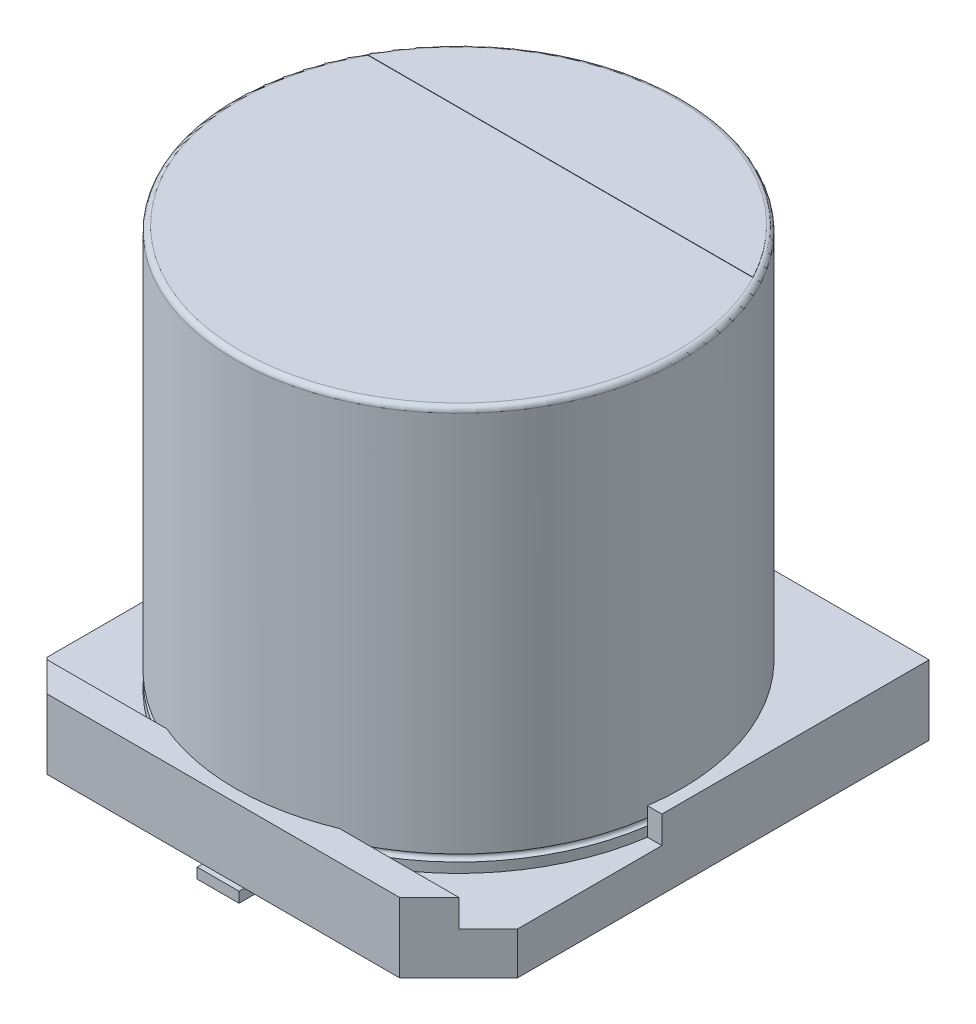
ISO-10303-21;
HEADER;
FILE_DESCRIPTION(('STEP AP214'),'2;1');
FILE_NAME('part.step','',(''),(''),'','','');
FILE_SCHEMA(('AUTOMOTIVE_DESIGN { 1 0 10303 214 1 1 1 1 }'));
ENDSEC;
DATA;
#1=APPLICATION_CONTEXT('core data for automotive mechanical design processes');
#2=APPLICATION_PROTOCOL_DEFINITION('international standard','automotive_design',2000,#1);
#3=PRODUCT_CONTEXT('',#1,'mechanical');
#4=PRODUCT('Part','Part','',(#3));
#5=PRODUCT_RELATED_PRODUCT_CATEGORY('part','',(#4));
#6=PRODUCT_DEFINITION_FORMATION('','',#4);
#7=PRODUCT_DEFINITION_CONTEXT('part definition',#1,'design');
#8=PRODUCT_DEFINITION('design','',#6,#7);
#9=PRODUCT_DEFINITION_SHAPE('','',#8);
#10=(LENGTH_UNIT() NAMED_UNIT(*) SI_UNIT(.MILLI.,.METRE.));
#11=(NAMED_UNIT(*) PLANE_ANGLE_UNIT() SI_UNIT($,.RADIAN.));
#12=(NAMED_UNIT(*) SI_UNIT($,.STERADIAN.) SOLID_ANGLE_UNIT());
#13=UNCERTAINTY_MEASURE_WITH_UNIT(LENGTH_MEASURE(1.E-05),#10,'distance_accuracy_value','');
#14=(GEOMETRIC_REPRESENTATION_CONTEXT(3) GLOBAL_UNCERTAINTY_ASSIGNED_CONTEXT((#13)) GLOBAL_UNIT_ASSIGNED_CONTEXT((#10,
#11,#12)) REPRESENTATION_CONTEXT('',''));
#15=CARTESIAN_POINT('',(0.,0.,0.));
#16=DIRECTION('',(0.,0.,1.));
#17=DIRECTION('',(1.,0.,0.));
#18=AXIS2_PLACEMENT_3D('',#15,#16,#17);
#19=CARTESIAN_POINT('',(0.,0.,0.));
#20=DIRECTION('',(0.,-1.,0.));
#21=DIRECTION('',(0.,0.,-1.));
#22=AXIS2_PLACEMENT_3D('',#19,#20,#21);
#23=PLANE('',#22);
#24=DIRECTION('',(-1.,0.,0.));
#25=VECTOR('',#24,1.);
#26=CARTESIAN_POINT('',(0.6,0.,-2.2));
#27=LINE('',#26,#25);
#28=CARTESIAN_POINT('',(0.6,0.,-2.2));
#29=VERTEX_POINT('',#28);
#30=CARTESIAN_POINT('',(-0.6,0.,-2.2));
#31=VERTEX_POINT('',#30);
#32=EDGE_CURVE('E721',#29,#31,#27,.T.);
#33=ORIENTED_EDGE('',*,*,#32,.F.);
#34=DIRECTION('',(0.,0.,-1.));
#35=VECTOR('',#34,1.);
#36=CARTESIAN_POINT('',(0.599999999999999,0.,0.));
#37=LINE('',#36,#35);
#38=CARTESIAN_POINT('',(0.600000000000001,0.,-6.75));
#39=VERTEX_POINT('',#38);
#40=EDGE_CURVE('E11',#29,#39,#37,.T.);
#41=ORIENTED_EDGE('',*,*,#40,.T.);
#42=DIRECTION('',(-1.,0.,0.));
#43=VECTOR('',#42,1.);
#44=CARTESIAN_POINT('',(-6.75,0.,-6.75));
#45=LINE('',#44,#43);
#46=CARTESIAN_POINT('',(6.75,0.,-6.75));
#47=VERTEX_POINT('',#46);
#48=EDGE_CURVE('E419',#47,#39,#45,.T.);
#49=ORIENTED_EDGE('',*,*,#48,.F.);
#50=DIRECTION('',(0.,0.,-1.));
#51=VECTOR('',#50,1.);
#52=CARTESIAN_POINT('',(6.75,0.,-6.75));
#53=LINE('',#52,#51);
#54=CARTESIAN_POINT('',(6.75,0.,5.06177222539985));
#55=VERTEX_POINT('',#54);
#56=EDGE_CURVE('E453',#55,#47,#53,.T.);
#57=ORIENTED_EDGE('',*,*,#56,.F.);
#58=DIRECTION('',(0.707106781186547,0.,-0.707106781186548));
#59=VECTOR('',#58,1.);
#60=CARTESIAN_POINT('',(6.75,0.,5.06177222539985));
#61=LINE('',#60,#59);
#62=CARTESIAN_POINT('',(5.06177222539986,0.,6.75));
#63=VERTEX_POINT('',#62);
#64=EDGE_CURVE('E448',#63,#55,#61,.T.);
#65=ORIENTED_EDGE('',*,*,#64,.F.);
#66=DIRECTION('',(1.,0.,0.));
#67=VECTOR('',#66,1.);
#68=CARTESIAN_POINT('',(5.06177222539986,0.,6.75));
#69=LINE('',#68,#67);
#70=CARTESIAN_POINT('',(0.599999999999999,0.,6.75));
#71=VERTEX_POINT('',#70);
#72=EDGE_CURVE('E443',#71,#63,#69,.T.);
#73=ORIENTED_EDGE('',*,*,#72,.F.);
#74=DIRECTION('',(0.,0.,1.));
#75=VECTOR('',#74,1.);
#76=CARTESIAN_POINT('',(0.599999999999999,0.,2.2));
#77=LINE('',#76,#75);
#78=CARTESIAN_POINT('',(0.599999999999999,0.,2.2));
#79=VERTEX_POINT('',#78);
#80=EDGE_CURVE('E292',#79,#71,#77,.T.);
#81=ORIENTED_EDGE('',*,*,#80,.F.);
#82=DIRECTION('',(1.,0.,0.));
#83=VECTOR('',#82,1.);
#84=CARTESIAN_POINT('',(0.599999999999999,0.,2.2));
#85=LINE('',#84,#83);
#86=CARTESIAN_POINT('',(-0.600000000000001,0.,2.2));
#87=VERTEX_POINT('',#86);
#88=EDGE_CURVE('E65',#87,#79,#85,.T.);
#89=ORIENTED_EDGE('',*,*,#88,.F.);
#90=DIRECTION('',(0.,0.,-1.));
#91=VECTOR('',#90,1.);
#92=CARTESIAN_POINT('',(-0.600000000000001,0.,2.2));
#93=LINE('',#92,#91);
#94=CARTESIAN_POINT('',(-0.600000000000001,0.,6.75));
#95=VERTEX_POINT('',#94);
#96=EDGE_CURVE('E50',#95,#87,#93,.T.);
#97=ORIENTED_EDGE('',*,*,#96,.F.);
#98=CARTESIAN_POINT('',(-5.06177222539986,0.,6.75));
#99=VERTEX_POINT('',#98);
#100=EDGE_CURVE('E444',#99,#95,#69,.T.);
#101=ORIENTED_EDGE('',*,*,#100,.F.);
#102=DIRECTION('',(0.707106781186547,0.,0.707106781186548));
#103=VECTOR('',#102,1.);
#104=CARTESIAN_POINT('',(-5.06177222539986,0.,6.75));
#105=LINE('',#104,#103);
#106=CARTESIAN_POINT('',(-6.75,0.,5.06177222539985));
#107=VERTEX_POINT('',#106);
#108=EDGE_CURVE('E440',#107,#99,#105,.T.);
#109=ORIENTED_EDGE('',*,*,#108,.F.);
#110=DIRECTION('',(0.,0.,1.));
#111=VECTOR('',#110,1.);
#112=CARTESIAN_POINT('',(-6.75,0.,5.06177222539985));
#113=LINE('',#112,#111);
#114=CARTESIAN_POINT('',(-6.75,0.,-6.75));
#115=VERTEX_POINT('',#114);
#116=EDGE_CURVE('E436',#115,#107,#113,.T.);
#117=ORIENTED_EDGE('',*,*,#116,.F.);
#118=CARTESIAN_POINT('',(-0.599999999999999,0.,-6.75));
#119=VERTEX_POINT('',#118);
#120=EDGE_CURVE('E456',#119,#115,#45,.T.);
#121=ORIENTED_EDGE('',*,*,#120,.F.);
#122=DIRECTION('',(0.,0.,-1.));
#123=VECTOR('',#122,1.);
#124=CARTESIAN_POINT('',(-0.6,0.,-2.2));
#125=LINE('',#124,#123);
#126=EDGE_CURVE('E720',#31,#119,#125,.T.);
#127=ORIENTED_EDGE('',*,*,#126,.F.);
#128=EDGE_LOOP('',(#33,#41,#49,#57,#65,#73,#81,#89,#97,#101,#109,#117,#121,#127));
#129=FACE_BOUND('',#128,.T.);
#130=ADVANCED_FACE('F41',(#129),#23,.T.);
#131=CARTESIAN_POINT('',(-6.25,12.8,0.));
#132=DIRECTION('',(0.,1.,0.));
#133=DIRECTION('',(0.,0.,1.));
#134=AXIS2_PLACEMENT_3D('',#131,#132,#133);
#135=PLANE('',#134);
#136=CARTESIAN_POINT('',(0.,12.8,0.));
#137=DIRECTION('',(0.,1.,0.));
#138=DIRECTION('',(0.,0.,1.));
#139=AXIS2_PLACEMENT_3D('',#136,#137,#138);
#140=CIRCLE('',#139,6.25);
#141=CARTESIAN_POINT('',(-5.52535958859638,12.8,-2.92111304415047));
#142=VERTEX_POINT('',#141);
#143=CARTESIAN_POINT('',(5.52535958859638,12.8,-2.92111304415047));
#144=VERTEX_POINT('',#143);
#145=EDGE_CURVE('E348',#142,#144,#140,.T.);
#146=ORIENTED_EDGE('',*,*,#145,.T.);
#147=DIRECTION('',(1.,0.,0.));
#148=VECTOR('',#147,1.);
#149=CARTESIAN_POINT('',(-5.52535958859638,12.8,-2.92111304415047));
#150=LINE('',#149,#148);
#151=EDGE_CURVE('E313',#142,#144,#150,.T.);
#152=ORIENTED_EDGE('',*,*,#151,.F.);
#153=EDGE_LOOP('',(#146,#152));
#154=FACE_BOUND('',#153,.T.);
#155=ADVANCED_FACE('F572',(#154),#135,.T.);
#156=CARTESIAN_POINT('',(0.,1.,0.));
#157=DIRECTION('',(0.,1.,0.));
#158=DIRECTION('',(0.,0.,1.));
#159=AXIS2_PLACEMENT_3D('',#156,#157,#158);
#160=CYLINDRICAL_SURFACE('',#159,6.4);
#161=DIRECTION('',(0.,1.,0.));
#162=VECTOR('',#161,1.);
#163=CARTESIAN_POINT('',(6.33403504884525,1.,0.916515138991168));
#164=LINE('',#163,#162);
#165=CARTESIAN_POINT('',(6.33403504884525,1.5,0.916515138991168));
#166=VERTEX_POINT('',#165);
#167=CARTESIAN_POINT('',(6.33403504884525,1.7,0.916515138991168));
#168=VERTEX_POINT('',#167);
#169=EDGE_CURVE('E492',#166,#168,#164,.T.);
#170=ORIENTED_EDGE('',*,*,#169,.T.);
#171=CARTESIAN_POINT('',(0.,1.7,0.));
#172=DIRECTION('',(0.,1.,0.));
#173=DIRECTION('',(0.,0.,1.));
#174=AXIS2_PLACEMENT_3D('',#171,#172,#173);
#175=CIRCLE('',#174,6.4);
#176=CARTESIAN_POINT('',(-6.33403504884525,1.7,0.916515138991168));
#177=VERTEX_POINT('',#176);
#178=EDGE_CURVE('E344',#168,#177,#175,.T.);
#179=ORIENTED_EDGE('',*,*,#178,.T.);
#180=DIRECTION('',(0.,1.,0.));
#181=VECTOR('',#180,1.);
#182=CARTESIAN_POINT('',(-6.33403504884525,1.,0.916515138991168));
#183=LINE('',#182,#181);
#184=CARTESIAN_POINT('',(-6.33403504884525,1.5,0.916515138991168));
#185=VERTEX_POINT('',#184);
#186=EDGE_CURVE('E500',#177,#185,#183,.F.);
#187=ORIENTED_EDGE('',*,*,#186,.T.);
#188=CARTESIAN_POINT('',(0.,1.5,0.));
#189=DIRECTION('',(0.,1.,0.));
#190=DIRECTION('',(0.,0.,1.));
#191=AXIS2_PLACEMENT_3D('',#188,#189,#190);
#192=CIRCLE('',#191,6.4);
#193=EDGE_CURVE('E338',#166,#185,#192,.T.);
#194=ORIENTED_EDGE('',*,*,#193,.F.);
#195=EDGE_LOOP('',(#170,#179,#187,#194));
#196=FACE_BOUND('',#195,.T.);
#197=ADVANCED_FACE('F517',(#196),#160,.F.);
#198=CARTESIAN_POINT('',(0.,2.,0.));
#199=DIRECTION('',(0.,-1.,0.));
#200=DIRECTION('',(0.,0.,-1.));
#201=AXIS2_PLACEMENT_3D('',#198,#199,#200);
#202=PLANE('',#201);
#203=DIRECTION('',(0.,0.,1.));
#204=VECTOR('',#203,1.);
#205=CARTESIAN_POINT('',(-6.75,2.,5.06177222539985));
#206=LINE('',#205,#204);
#207=CARTESIAN_POINT('',(-6.75,2.,-6.75));
#208=VERTEX_POINT('',#207);
#209=CARTESIAN_POINT('',(-6.75,2.,0.916515138991168));
#210=VERTEX_POINT('',#209);
#211=EDGE_CURVE('E414',#208,#210,#206,.T.);
#212=ORIENTED_EDGE('',*,*,#211,.T.);
#213=DIRECTION('',(1.,0.,0.));
#214=VECTOR('',#213,1.);
#215=CARTESIAN_POINT('',(0.,2.,0.916515138991168));
#216=LINE('',#215,#214);
#217=CARTESIAN_POINT('',(-6.33403504884525,2.,0.916515138991168));
#218=VERTEX_POINT('',#217);
#219=EDGE_CURVE('E408',#210,#218,#216,.T.);
#220=ORIENTED_EDGE('',*,*,#219,.T.);
#221=CARTESIAN_POINT('',(0.,2.,0.));
#222=DIRECTION('',(0.,1.,0.));
#223=DIRECTION('',(0.,0.,1.));
#224=AXIS2_PLACEMENT_3D('',#221,#222,#223);
#225=CIRCLE('',#224,6.4);
#226=CARTESIAN_POINT('',(6.33403504884525,2.,0.916515138991168));
#227=VERTEX_POINT('',#226);
#228=EDGE_CURVE('E413',#227,#218,#225,.T.);
#229=ORIENTED_EDGE('',*,*,#228,.F.);
#230=CARTESIAN_POINT('',(6.75,2.,0.916515138991168));
#231=VERTEX_POINT('',#230);
#232=EDGE_CURVE('E404',#227,#231,#216,.T.);
#233=ORIENTED_EDGE('',*,*,#232,.T.);
#234=DIRECTION('',(0.,0.,-1.));
#235=VECTOR('',#234,1.);
#236=CARTESIAN_POINT('',(6.75,2.,-6.75));
#237=LINE('',#236,#235);
#238=CARTESIAN_POINT('',(6.75,2.,-6.75));
#239=VERTEX_POINT('',#238);
#240=EDGE_CURVE('E429',#231,#239,#237,.T.);
#241=ORIENTED_EDGE('',*,*,#240,.T.);
#242=DIRECTION('',(-1.,0.,0.));
#243=VECTOR('',#242,1.);
#244=CARTESIAN_POINT('',(-6.75,2.,-6.75));
#245=LINE('',#244,#243);
#246=EDGE_CURVE('E432',#239,#208,#245,.T.);
#247=ORIENTED_EDGE('',*,*,#246,.T.);
#248=EDGE_LOOP('',(#212,#220,#229,#233,#241,#247));
#249=FACE_BOUND('',#248,.T.);
#250=ADVANCED_FACE('F604',(#249),#202,.F.);
#251=CARTESIAN_POINT('',(-6.75,2.,5.06177222539985));
#252=DIRECTION('',(1.,0.,0.));
#253=DIRECTION('',(0.,0.,-1.));
#254=AXIS2_PLACEMENT_3D('',#251,#252,#253);
#255=PLANE('',#254);
#256=DIRECTION('',(0.,0.,1.));
#257=VECTOR('',#256,1.);
#258=CARTESIAN_POINT('',(-6.75,1.21736242578591,0.916515138991168));
#259=LINE('',#258,#257);
#260=CARTESIAN_POINT('',(-6.75,1.21736242578591,0.916515138991168));
#261=VERTEX_POINT('',#260);
#262=CARTESIAN_POINT('',(-6.75,1.21736242578591,5.06177222539985));
#263=VERTEX_POINT('',#262);
#264=EDGE_CURVE('E370',#261,#263,#259,.T.);
#265=ORIENTED_EDGE('',*,*,#264,.F.);
#266=DIRECTION('',(0.,-1.,0.));
#267=VECTOR('',#266,1.);
#268=CARTESIAN_POINT('',(-6.75,1.21736242578591,0.916515138991168));
#269=LINE('',#268,#267);
#270=EDGE_CURVE('E362',#210,#261,#269,.T.);
#271=ORIENTED_EDGE('',*,*,#270,.F.);
#272=ORIENTED_EDGE('',*,*,#211,.F.);
#273=DIRECTION('',(0.,-1.,0.));
#274=VECTOR('',#273,1.);
#275=CARTESIAN_POINT('',(-6.75,2.,-6.75));
#276=LINE('',#275,#274);
#277=EDGE_CURVE('E435',#208,#115,#276,.T.);
#278=ORIENTED_EDGE('',*,*,#277,.T.);
#279=ORIENTED_EDGE('',*,*,#116,.T.);
#280=DIRECTION('',(0.,-1.,0.));
#281=VECTOR('',#280,1.);
#282=CARTESIAN_POINT('',(-6.75,2.,5.06177222539985));
#283=LINE('',#282,#281);
#284=EDGE_CURVE('E479',#263,#107,#283,.T.);
#285=ORIENTED_EDGE('',*,*,#284,.F.);
#286=EDGE_LOOP('',(#265,#271,#272,#278,#279,#285));
#287=FACE_BOUND('',#286,.T.);
#288=ADVANCED_FACE('F43',(#287),#255,.F.);
#289=CARTESIAN_POINT('',(-5.06177222539986,2.,6.75));
#290=DIRECTION('',(0.707106781186548,0.,-0.707106781186547));
#291=DIRECTION('',(-0.707106781186547,0.,-0.707106781186548));
#292=AXIS2_PLACEMENT_3D('',#289,#290,#291);
#293=PLANE('',#292);
#294=DIRECTION('',(0.707106781186547,0.,0.707106781186548));
#295=VECTOR('',#294,1.);
#296=CARTESIAN_POINT('',(-5.06177222539986,2.,6.75));
#297=LINE('',#296,#295);
#298=CARTESIAN_POINT('',(-5.91175806377659,2.,5.90001416162327));
#299=VERTEX_POINT('',#298);
#300=CARTESIAN_POINT('',(-5.06177222539986,2.,6.75));
#301=VERTEX_POINT('',#300);
#302=EDGE_CURVE('E418',#299,#301,#297,.T.);
#303=ORIENTED_EDGE('',*,*,#302,.F.);
#304=DIRECTION('',(0.,-1.,0.));
#305=VECTOR('',#304,1.);
#306=CARTESIAN_POINT('',(-5.91175806377659,2.,5.90001416162327));
#307=LINE('',#306,#305);
#308=CARTESIAN_POINT('',(-5.91175806377658,1.21736242578591,5.90001416162327));
#309=VERTEX_POINT('',#308);
#310=EDGE_CURVE('E395',#299,#309,#307,.T.);
#311=ORIENTED_EDGE('',*,*,#310,.T.);
#312=DIRECTION('',(-0.707106781186547,0.,-0.707106781186548));
#313=VECTOR('',#312,1.);
#314=CARTESIAN_POINT('',(-5.06177222539986,1.21736242578591,6.75));
#315=LINE('',#314,#313);
#316=EDGE_CURVE('E387',#309,#263,#315,.T.);
#317=ORIENTED_EDGE('',*,*,#316,.T.);
#318=ORIENTED_EDGE('',*,*,#284,.T.);
#319=ORIENTED_EDGE('',*,*,#108,.T.);
#320=DIRECTION('',(0.,-1.,0.));
#321=VECTOR('',#320,1.);
#322=CARTESIAN_POINT('',(-5.06177222539986,2.,6.75));
#323=LINE('',#322,#321);
#324=EDGE_CURVE('E475',#301,#99,#323,.T.);
#325=ORIENTED_EDGE('',*,*,#324,.F.);
#326=EDGE_LOOP('',(#303,#311,#317,#318,#319,#325));
#327=FACE_BOUND('',#326,.T.);
#328=ADVANCED_FACE('F597',(#327),#293,.F.);
#329=CARTESIAN_POINT('',(5.06177222539986,2.,6.75));
#330=DIRECTION('',(0.,0.,-1.));
#331=DIRECTION('',(-1.,0.,0.));
#332=AXIS2_PLACEMENT_3D('',#329,#330,#331);
#333=PLANE('',#332);
#334=ORIENTED_EDGE('',*,*,#100,.T.);
#335=EDGE_CURVE('E449',#95,#71,#69,.T.);
#336=ORIENTED_EDGE('',*,*,#335,.T.);
#337=ORIENTED_EDGE('',*,*,#72,.T.);
#338=DIRECTION('',(0.,-1.,0.));
#339=VECTOR('',#338,1.);
#340=CARTESIAN_POINT('',(5.06177222539986,2.,6.75));
#341=LINE('',#340,#339);
#342=CARTESIAN_POINT('',(5.06177222539986,2.,6.75));
#343=VERTEX_POINT('',#342);
#344=EDGE_CURVE('E471',#343,#63,#341,.T.);
#345=ORIENTED_EDGE('',*,*,#344,.F.);
#346=DIRECTION('',(1.,0.,0.));
#347=VECTOR('',#346,1.);
#348=CARTESIAN_POINT('',(5.06177222539986,2.,6.75));
#349=LINE('',#348,#347);
#350=EDGE_CURVE('E422',#301,#343,#349,.T.);
#351=ORIENTED_EDGE('',*,*,#350,.F.);
#352=ORIENTED_EDGE('',*,*,#324,.T.);
#353=EDGE_LOOP('',(#334,#336,#337,#345,#351,#352));
#354=FACE_BOUND('',#353,.T.);
#355=ADVANCED_FACE('F594',(#354),#333,.F.);
#356=CARTESIAN_POINT('',(6.75,2.,5.06177222539985));
#357=DIRECTION('',(-0.707106781186548,0.,-0.707106781186547));
#358=DIRECTION('',(-0.707106781186547,0.,0.707106781186548));
#359=AXIS2_PLACEMENT_3D('',#356,#357,#358);
#360=PLANE('',#359);
#361=DIRECTION('',(-0.707106781186547,0.,0.707106781186548));
#362=VECTOR('',#361,1.);
#363=CARTESIAN_POINT('',(6.75,1.21736242578591,5.06177222539985));
#364=LINE('',#363,#362);
#365=CARTESIAN_POINT('',(6.75,1.21736242578591,5.06177222539985));
#366=VERTEX_POINT('',#365);
#367=CARTESIAN_POINT('',(5.91175806377659,1.21736242578591,5.90001416162327));
#368=VERTEX_POINT('',#367);
#369=EDGE_CURVE('E383',#366,#368,#364,.T.);
#370=ORIENTED_EDGE('',*,*,#369,.T.);
#371=DIRECTION('',(0.,1.,0.));
#372=VECTOR('',#371,1.);
#373=CARTESIAN_POINT('',(5.91175806377659,2.,5.90001416162327));
#374=LINE('',#373,#372);
#375=CARTESIAN_POINT('',(5.91175806377659,2.,5.90001416162327));
#376=VERTEX_POINT('',#375);
#377=EDGE_CURVE('E400',#368,#376,#374,.T.);
#378=ORIENTED_EDGE('',*,*,#377,.T.);
#379=DIRECTION('',(0.707106781186547,0.,-0.707106781186548));
#380=VECTOR('',#379,1.);
#381=CARTESIAN_POINT('',(6.75,2.,5.06177222539985));
#382=LINE('',#381,#380);
#383=EDGE_CURVE('E425',#343,#376,#382,.T.);
#384=ORIENTED_EDGE('',*,*,#383,.F.);
#385=ORIENTED_EDGE('',*,*,#344,.T.);
#386=ORIENTED_EDGE('',*,*,#64,.T.);
#387=DIRECTION('',(0.,-1.,0.));
#388=VECTOR('',#387,1.);
#389=CARTESIAN_POINT('',(6.75,2.,5.06177222539985));
#390=LINE('',#389,#388);
#391=EDGE_CURVE('E468',#366,#55,#390,.T.);
#392=ORIENTED_EDGE('',*,*,#391,.F.);
#393=EDGE_LOOP('',(#370,#378,#384,#385,#386,#392));
#394=FACE_BOUND('',#393,.T.);
#395=ADVANCED_FACE('F590',(#394),#360,.F.);
#396=CARTESIAN_POINT('',(6.75,2.,-6.75));
#397=DIRECTION('',(-1.,0.,0.));
#398=DIRECTION('',(0.,0.,1.));
#399=AXIS2_PLACEMENT_3D('',#396,#397,#398);
#400=PLANE('',#399);
#401=ORIENTED_EDGE('',*,*,#240,.F.);
#402=DIRECTION('',(0.,1.,0.));
#403=VECTOR('',#402,1.);
#404=CARTESIAN_POINT('',(6.75,1.21736242578591,0.916515138991168));
#405=LINE('',#404,#403);
#406=CARTESIAN_POINT('',(6.75,1.21736242578591,0.916515138991168));
#407=VERTEX_POINT('',#406);
#408=EDGE_CURVE('E363',#407,#231,#405,.T.);
#409=ORIENTED_EDGE('',*,*,#408,.F.);
#410=DIRECTION('',(0.,0.,-1.));
#411=VECTOR('',#410,1.);
#412=CARTESIAN_POINT('',(6.75,1.21736242578591,0.916515138991168));
#413=LINE('',#412,#411);
#414=EDGE_CURVE('E366',#366,#407,#413,.T.);
#415=ORIENTED_EDGE('',*,*,#414,.F.);
#416=ORIENTED_EDGE('',*,*,#391,.T.);
#417=ORIENTED_EDGE('',*,*,#56,.T.);
#418=DIRECTION('',(0.,-1.,0.));
#419=VECTOR('',#418,1.);
#420=CARTESIAN_POINT('',(6.75,2.,-6.75));
#421=LINE('',#420,#419);
#422=EDGE_CURVE('E464',#239,#47,#421,.T.);
#423=ORIENTED_EDGE('',*,*,#422,.F.);
#424=EDGE_LOOP('',(#401,#409,#415,#416,#417,#423));
#425=FACE_BOUND('',#424,.T.);
#426=ADVANCED_FACE('F586',(#425),#400,.F.);
#427=CARTESIAN_POINT('',(-6.75,2.,-6.75));
#428=DIRECTION('',(0.,0.,1.));
#429=DIRECTION('',(1.,0.,0.));
#430=AXIS2_PLACEMENT_3D('',#427,#428,#429);
#431=PLANE('',#430);
#432=ORIENTED_EDGE('',*,*,#48,.T.);
#433=EDGE_CURVE('E460',#39,#119,#45,.T.);
#434=ORIENTED_EDGE('',*,*,#433,.T.);
#435=ORIENTED_EDGE('',*,*,#120,.T.);
#436=ORIENTED_EDGE('',*,*,#277,.F.);
#437=ORIENTED_EDGE('',*,*,#246,.F.);
#438=ORIENTED_EDGE('',*,*,#422,.T.);
#439=EDGE_LOOP('',(#432,#434,#435,#436,#437,#438));
#440=FACE_BOUND('',#439,.T.);
#441=ADVANCED_FACE('F583',(#440),#431,.F.);
#442=ORIENTED_EDGE('',*,*,#383,.T.);
#443=DIRECTION('',(-1.,0.,0.));
#444=VECTOR('',#443,1.);
#445=CARTESIAN_POINT('',(0.,2.,5.90001416162327));
#446=LINE('',#445,#444);
#447=CARTESIAN_POINT('',(2.47988566120394,2.,5.90001416162327));
#448=VERTEX_POINT('',#447);
#449=EDGE_CURVE('E396',#376,#448,#446,.T.);
#450=ORIENTED_EDGE('',*,*,#449,.T.);
#451=CARTESIAN_POINT('',(-2.47988566120394,2.,5.90001416162327));
#452=VERTEX_POINT('',#451);
#453=EDGE_CURVE('E409',#452,#448,#225,.T.);
#454=ORIENTED_EDGE('',*,*,#453,.F.);
#455=EDGE_CURVE('E391',#452,#299,#446,.T.);
#456=ORIENTED_EDGE('',*,*,#455,.T.);
#457=ORIENTED_EDGE('',*,*,#302,.T.);
#458=ORIENTED_EDGE('',*,*,#350,.T.);
#459=EDGE_LOOP('',(#442,#450,#454,#456,#457,#458));
#460=FACE_BOUND('',#459,.T.);
#461=ADVANCED_FACE('F581',(#460),#202,.F.);
#462=DIRECTION('',(0.,1.,0.));
#463=VECTOR('',#462,1.);
#464=CARTESIAN_POINT('',(-2.47988566120394,1.,5.90001416162327));
#465=LINE('',#464,#463);
#466=CARTESIAN_POINT('',(-2.47988566120394,1.5,5.90001416162327));
#467=VERTEX_POINT('',#466);
#468=CARTESIAN_POINT('',(-2.47988566120394,1.7,5.90001416162327));
#469=VERTEX_POINT('',#468);
#470=EDGE_CURVE('E501',#467,#469,#465,.T.);
#471=ORIENTED_EDGE('',*,*,#470,.T.);
#472=CARTESIAN_POINT('',(2.47988566120394,1.7,5.90001416162327));
#473=VERTEX_POINT('',#472);
#474=EDGE_CURVE('E337',#469,#473,#175,.T.);
#475=ORIENTED_EDGE('',*,*,#474,.T.);
#476=DIRECTION('',(0.,1.,0.));
#477=VECTOR('',#476,1.);
#478=CARTESIAN_POINT('',(2.47988566120394,1.,5.90001416162327));
#479=LINE('',#478,#477);
#480=CARTESIAN_POINT('',(2.47988566120394,1.5,5.90001416162327));
#481=VERTEX_POINT('',#480);
#482=EDGE_CURVE('E486',#473,#481,#479,.F.);
#483=ORIENTED_EDGE('',*,*,#482,.T.);
#484=EDGE_CURVE('E332',#467,#481,#192,.T.);
#485=ORIENTED_EDGE('',*,*,#484,.F.);
#486=EDGE_LOOP('',(#471,#475,#483,#485));
#487=FACE_BOUND('',#486,.T.);
#488=ADVANCED_FACE('F640',(#487),#160,.F.);
#489=CARTESIAN_POINT('',(11.9843862563784,1.21736242578591,0.916515138991168));
#490=DIRECTION('',(0.,-1.,0.));
#491=DIRECTION('',(0.,0.,-1.));
#492=AXIS2_PLACEMENT_3D('',#489,#490,#491);
#493=PLANE('',#492);
#494=ORIENTED_EDGE('',*,*,#414,.T.);
#495=DIRECTION('',(-1.,0.,0.));
#496=VECTOR('',#495,1.);
#497=CARTESIAN_POINT('',(11.9843862563784,1.21736242578591,0.916515138991168));
#498=LINE('',#497,#496);
#499=CARTESIAN_POINT('',(6.33403504884525,1.21736242578591,0.916515138991168));
#500=VERTEX_POINT('',#499);
#501=EDGE_CURVE('E378',#407,#500,#498,.T.);
#502=ORIENTED_EDGE('',*,*,#501,.T.);
#503=CARTESIAN_POINT('',(0.,1.21736242578591,0.));
#504=DIRECTION('',(0.,-1.,0.));
#505=DIRECTION('',(0.,0.,-1.));
#506=AXIS2_PLACEMENT_3D('',#503,#504,#505);
#507=CIRCLE('',#506,6.4);
#508=CARTESIAN_POINT('',(2.47988566120394,1.21736242578591,5.90001416162327));
#509=VERTEX_POINT('',#508);
#510=EDGE_CURVE('E482',#509,#500,#507,.F.);
#511=ORIENTED_EDGE('',*,*,#510,.F.);
#512=DIRECTION('',(-1.,0.,0.));
#513=VECTOR('',#512,1.);
#514=CARTESIAN_POINT('',(11.9843862563784,1.21736242578591,5.90001416162327));
#515=LINE('',#514,#513);
#516=EDGE_CURVE('E367',#368,#509,#515,.T.);
#517=ORIENTED_EDGE('',*,*,#516,.F.);
#518=ORIENTED_EDGE('',*,*,#369,.F.);
#519=EDGE_LOOP('',(#494,#502,#511,#517,#518));
#520=FACE_BOUND('',#519,.T.);
#521=ADVANCED_FACE('F669',(#520),#493,.F.);
#522=CARTESIAN_POINT('',(11.9843862563784,1.21736242578591,5.90001416162327));
#523=DIRECTION('',(0.,0.,1.));
#524=DIRECTION('',(1.,0.,0.));
#525=AXIS2_PLACEMENT_3D('',#522,#523,#524);
#526=PLANE('',#525);
#527=ORIENTED_EDGE('',*,*,#516,.T.);
#528=DIRECTION('',(0.,1.,0.));
#529=VECTOR('',#528,1.);
#530=CARTESIAN_POINT('',(2.47988566120394,12.8,5.90001416162327));
#531=LINE('',#530,#529);
#532=EDGE_CURVE('E356',#509,#481,#531,.T.);
#533=ORIENTED_EDGE('',*,*,#532,.T.);
#534=ORIENTED_EDGE('',*,*,#482,.F.);
#535=EDGE_CURVE('E488',#448,#473,#479,.F.);
#536=ORIENTED_EDGE('',*,*,#535,.F.);
#537=ORIENTED_EDGE('',*,*,#449,.F.);
#538=ORIENTED_EDGE('',*,*,#377,.F.);
#539=EDGE_LOOP('',(#527,#533,#534,#536,#537,#538));
#540=FACE_BOUND('',#539,.T.);
#541=ADVANCED_FACE('F644',(#540),#526,.F.);
#542=CARTESIAN_POINT('',(11.9843862563784,1.21736242578591,0.916515138991168));
#543=DIRECTION('',(0.,0.,-1.));
#544=DIRECTION('',(-1.,0.,0.));
#545=AXIS2_PLACEMENT_3D('',#542,#543,#544);
#546=PLANE('',#545);
#547=EDGE_CURVE('E493',#500,#166,#164,.T.);
#548=ORIENTED_EDGE('',*,*,#547,.F.);
#549=ORIENTED_EDGE('',*,*,#501,.F.);
#550=ORIENTED_EDGE('',*,*,#408,.T.);
#551=ORIENTED_EDGE('',*,*,#232,.F.);
#552=DIRECTION('',(0.,1.,0.));
#553=VECTOR('',#552,1.);
#554=CARTESIAN_POINT('',(6.33403504884525,12.8,0.916515138991168));
#555=LINE('',#554,#553);
#556=EDGE_CURVE('E359',#227,#168,#555,.F.);
#557=ORIENTED_EDGE('',*,*,#556,.T.);
#558=ORIENTED_EDGE('',*,*,#169,.F.);
#559=EDGE_LOOP('',(#548,#549,#550,#551,#557,#558));
#560=FACE_BOUND('',#559,.T.);
#561=ADVANCED_FACE('F668',(#560),#546,.F.);
#562=ORIENTED_EDGE('',*,*,#270,.T.);
#563=CARTESIAN_POINT('',(-6.33403504884525,1.21736242578591,0.916515138991168));
#564=VERTEX_POINT('',#563);
#565=EDGE_CURVE('E373',#564,#261,#498,.T.);
#566=ORIENTED_EDGE('',*,*,#565,.F.);
#567=DIRECTION('',(0.,1.,0.));
#568=VECTOR('',#567,1.);
#569=CARTESIAN_POINT('',(-6.33403504884525,12.8,0.916515138991168));
#570=LINE('',#569,#568);
#571=EDGE_CURVE('E353',#564,#185,#570,.T.);
#572=ORIENTED_EDGE('',*,*,#571,.T.);
#573=ORIENTED_EDGE('',*,*,#186,.F.);
#574=EDGE_CURVE('E503',#218,#177,#183,.F.);
#575=ORIENTED_EDGE('',*,*,#574,.F.);
#576=ORIENTED_EDGE('',*,*,#219,.F.);
#577=EDGE_LOOP('',(#562,#566,#572,#573,#575,#576));
#578=FACE_BOUND('',#577,.T.);
#579=ADVANCED_FACE('F630',(#578),#546,.F.);
#580=ORIENTED_EDGE('',*,*,#455,.F.);
#581=EDGE_CURVE('E502',#469,#452,#465,.T.);
#582=ORIENTED_EDGE('',*,*,#581,.F.);
#583=ORIENTED_EDGE('',*,*,#470,.F.);
#584=CARTESIAN_POINT('',(-2.47988566120394,1.21736242578591,5.90001416162327));
#585=VERTEX_POINT('',#584);
#586=EDGE_CURVE('E497',#585,#467,#465,.T.);
#587=ORIENTED_EDGE('',*,*,#586,.F.);
#588=EDGE_CURVE('E374',#585,#309,#515,.T.);
#589=ORIENTED_EDGE('',*,*,#588,.T.);
#590=ORIENTED_EDGE('',*,*,#310,.F.);
#591=EDGE_LOOP('',(#580,#582,#583,#587,#589,#590));
#592=FACE_BOUND('',#591,.T.);
#593=ADVANCED_FACE('F615',(#592),#526,.F.);
#594=ORIENTED_EDGE('',*,*,#588,.F.);
#595=EDGE_CURVE('E487',#564,#585,#507,.F.);
#596=ORIENTED_EDGE('',*,*,#595,.F.);
#597=ORIENTED_EDGE('',*,*,#565,.T.);
#598=ORIENTED_EDGE('',*,*,#264,.T.);
#599=ORIENTED_EDGE('',*,*,#316,.F.);
#600=EDGE_LOOP('',(#594,#596,#597,#598,#599));
#601=FACE_BOUND('',#600,.T.);
#602=ADVANCED_FACE('F628',(#601),#493,.F.);
#603=CARTESIAN_POINT('',(0.,12.8,0.));
#604=DIRECTION('',(0.,1.,0.));
#605=DIRECTION('',(0.,0.,1.));
#606=AXIS2_PLACEMENT_3D('',#603,#604,#605);
#607=CYLINDRICAL_SURFACE('',#606,6.4);
#608=CARTESIAN_POINT('',(0.,12.65,0.));
#609=DIRECTION('',(0.,1.,0.));
#610=DIRECTION('',(0.,0.,1.));
#611=AXIS2_PLACEMENT_3D('',#608,#609,#610);
#612=CIRCLE('',#611,6.4);
#613=CARTESIAN_POINT('',(0.,12.65,6.4));
#614=VERTEX_POINT('',#613);
#615=EDGE_CURVE('E343',#614,#614,#612,.T.);
#616=ORIENTED_EDGE('',*,*,#615,.F.);
#617=EDGE_LOOP('',(#616));
#618=FACE_BOUND('',#617,.T.);
#619=ORIENTED_EDGE('',*,*,#556,.F.);
#620=ORIENTED_EDGE('',*,*,#228,.T.);
#621=ORIENTED_EDGE('',*,*,#574,.T.);
#622=EDGE_CURVE('E620',#177,#469,#175,.T.);
#623=ORIENTED_EDGE('',*,*,#622,.T.);
#624=ORIENTED_EDGE('',*,*,#581,.T.);
#625=ORIENTED_EDGE('',*,*,#453,.T.);
#626=ORIENTED_EDGE('',*,*,#535,.T.);
#627=EDGE_CURVE('E339',#473,#168,#175,.T.);
#628=ORIENTED_EDGE('',*,*,#627,.T.);
#629=EDGE_LOOP('',(#619,#620,#621,#623,#624,#625,#626,#628));
#630=FACE_BOUND('',#629,.T.);
#631=ADVANCED_FACE('F619',(#618,#630),#607,.T.);
#632=CARTESIAN_POINT('',(0.,12.8,0.));
#633=DIRECTION('',(0.,1.,0.));
#634=DIRECTION('',(0.,0.,1.));
#635=AXIS2_PLACEMENT_3D('',#632,#633,#634);
#636=CYLINDRICAL_SURFACE('',#635,6.4);
#637=ORIENTED_EDGE('',*,*,#532,.F.);
#638=ORIENTED_EDGE('',*,*,#510,.T.);
#639=ORIENTED_EDGE('',*,*,#547,.T.);
#640=EDGE_CURVE('E333',#481,#166,#192,.T.);
#641=ORIENTED_EDGE('',*,*,#640,.F.);
#642=EDGE_LOOP('',(#637,#638,#639,#641));
#643=FACE_BOUND('',#642,.T.);
#644=ADVANCED_FACE('F662',(#643),#636,.T.);
#645=ORIENTED_EDGE('',*,*,#571,.F.);
#646=ORIENTED_EDGE('',*,*,#595,.T.);
#647=ORIENTED_EDGE('',*,*,#586,.T.);
#648=EDGE_CURVE('E525',#185,#467,#192,.T.);
#649=ORIENTED_EDGE('',*,*,#648,.F.);
#650=EDGE_LOOP('',(#645,#646,#647,#649));
#651=FACE_BOUND('',#650,.T.);
#652=ADVANCED_FACE('F526',(#651),#636,.T.);
#653=CARTESIAN_POINT('',(0.,12.65,0.));
#654=DIRECTION('',(0.,1.,0.));
#655=DIRECTION('',(0.,0.,1.));
#656=AXIS2_PLACEMENT_3D('',#653,#654,#655);
#657=TOROIDAL_SURFACE('',#656,6.25,0.149999999999999);
#658=ORIENTED_EDGE('',*,*,#615,.T.);
#659=EDGE_LOOP('',(#658));
#660=FACE_BOUND('',#659,.T.);
#661=EDGE_CURVE('E349',#144,#142,#140,.T.);
#662=ORIENTED_EDGE('',*,*,#661,.F.);
#663=ORIENTED_EDGE('',*,*,#145,.F.);
#664=EDGE_LOOP('',(#662,#663));
#665=FACE_BOUND('',#664,.T.);
#666=ADVANCED_FACE('F649',(#660,#665),#657,.T.);
#667=CARTESIAN_POINT('',(0.,1.6,0.));
#668=DIRECTION('',(0.,1.,0.));
#669=DIRECTION('',(0.,0.,1.));
#670=AXIS2_PLACEMENT_3D('',#667,#668,#669);
#671=TOROIDAL_SURFACE('',#670,6.4,0.1);
#672=ORIENTED_EDGE('',*,*,#640,.T.);
#673=ORIENTED_EDGE('',*,*,#193,.T.);
#674=ORIENTED_EDGE('',*,*,#648,.T.);
#675=ORIENTED_EDGE('',*,*,#484,.T.);
#676=EDGE_LOOP('',(#672,#673,#674,#675));
#677=FACE_BOUND('',#676,.T.);
#678=ORIENTED_EDGE('',*,*,#627,.F.);
#679=ORIENTED_EDGE('',*,*,#474,.F.);
#680=ORIENTED_EDGE('',*,*,#622,.F.);
#681=ORIENTED_EDGE('',*,*,#178,.F.);
#682=EDGE_LOOP('',(#678,#679,#680,#681));
#683=FACE_BOUND('',#682,.T.);
#684=ADVANCED_FACE('F531',(#677,#683),#671,.F.);
#685=CARTESIAN_POINT('',(0.,12.81,0.));
#686=DIRECTION('',(0.,-1.,0.));
#687=DIRECTION('',(0.,0.,-1.));
#688=AXIS2_PLACEMENT_3D('',#685,#686,#687);
#689=CYLINDRICAL_SURFACE('',#688,6.25);
#690=ORIENTED_EDGE('',*,*,#661,.T.);
#691=DIRECTION('',(0.,-1.,0.));
#692=VECTOR('',#691,1.);
#693=CARTESIAN_POINT('',(-5.52535958859638,12.81,-2.92111304415047));
#694=LINE('',#693,#692);
#695=CARTESIAN_POINT('',(-5.52535958859638,12.81,-2.92111304415047));
#696=VERTEX_POINT('',#695);
#697=EDGE_CURVE('E328',#696,#142,#694,.T.);
#698=ORIENTED_EDGE('',*,*,#697,.F.);
#699=CARTESIAN_POINT('',(0.,12.81,0.));
#700=DIRECTION('',(0.,1.,0.));
#701=DIRECTION('',(0.,0.,1.));
#702=AXIS2_PLACEMENT_3D('',#699,#700,#701);
#703=CIRCLE('',#702,6.25);
#704=CARTESIAN_POINT('',(5.52535958859638,12.81,-2.92111304415047));
#705=VERTEX_POINT('',#704);
#706=EDGE_CURVE('E314',#705,#696,#703,.T.);
#707=ORIENTED_EDGE('',*,*,#706,.F.);
#708=DIRECTION('',(0.,-1.,0.));
#709=VECTOR('',#708,1.);
#710=CARTESIAN_POINT('',(5.52535958859638,12.81,-2.92111304415047));
#711=LINE('',#710,#709);
#712=EDGE_CURVE('E321',#705,#144,#711,.T.);
#713=ORIENTED_EDGE('',*,*,#712,.T.);
#714=EDGE_LOOP('',(#690,#698,#707,#713));
#715=FACE_BOUND('',#714,.T.);
#716=ADVANCED_FACE('F648',(#715),#689,.T.);
#717=CARTESIAN_POINT('',(-5.52535958859638,12.81,-2.92111304415047));
#718=DIRECTION('',(0.,0.,-1.));
#719=DIRECTION('',(-1.,0.,0.));
#720=AXIS2_PLACEMENT_3D('',#717,#718,#719);
#721=PLANE('',#720);
#722=ORIENTED_EDGE('',*,*,#151,.T.);
#723=ORIENTED_EDGE('',*,*,#712,.F.);
#724=DIRECTION('',(1.,0.,0.));
#725=VECTOR('',#724,1.);
#726=CARTESIAN_POINT('',(-5.52535958859638,12.81,-2.92111304415047));
#727=LINE('',#726,#725);
#728=EDGE_CURVE('E318',#696,#705,#727,.T.);
#729=ORIENTED_EDGE('',*,*,#728,.F.);
#730=ORIENTED_EDGE('',*,*,#697,.T.);
#731=EDGE_LOOP('',(#722,#723,#729,#730));
#732=FACE_BOUND('',#731,.T.);
#733=ADVANCED_FACE('F655',(#732),#721,.F.);
#734=CARTESIAN_POINT('',(0.,12.81,0.));
#735=DIRECTION('',(0.,1.,0.));
#736=DIRECTION('',(0.,0.,1.));
#737=AXIS2_PLACEMENT_3D('',#734,#735,#736);
#738=PLANE('',#737);
#739=ORIENTED_EDGE('',*,*,#706,.T.);
#740=ORIENTED_EDGE('',*,*,#728,.T.);
#741=EDGE_LOOP('',(#739,#740));
#742=FACE_BOUND('',#741,.T.);
#743=ADVANCED_FACE('F569',(#742),#738,.T.);
#744=CARTESIAN_POINT('',(-0.600000000000001,-0.3,2.2));
#745=DIRECTION('',(1.,0.,0.));
#746=DIRECTION('',(0.,0.,-1.));
#747=AXIS2_PLACEMENT_3D('',#744,#745,#746);
#748=PLANE('',#747);
#749=CARTESIAN_POINT('',(-0.600000000000001,0.,6.9));
#750=VERTEX_POINT('',#749);
#751=EDGE_CURVE('E264',#750,#95,#93,.T.);
#752=ORIENTED_EDGE('',*,*,#751,.T.);
#753=ORIENTED_EDGE('',*,*,#96,.T.);
#754=DIRECTION('',(0.,1.,0.));
#755=VECTOR('',#754,1.);
#756=CARTESIAN_POINT('',(-0.600000000000001,-0.3,2.2));
#757=LINE('',#756,#755);
#758=CARTESIAN_POINT('',(-0.600000000000001,-0.3,2.2));
#759=VERTEX_POINT('',#758);
#760=EDGE_CURVE('E309',#759,#87,#757,.T.);
#761=ORIENTED_EDGE('',*,*,#760,.F.);
#762=DIRECTION('',(0.,0.,-1.));
#763=VECTOR('',#762,1.);
#764=CARTESIAN_POINT('',(-0.600000000000001,-0.3,2.2));
#765=LINE('',#764,#763);
#766=CARTESIAN_POINT('',(-0.600000000000001,-0.3,6.9));
#767=VERTEX_POINT('',#766);
#768=EDGE_CURVE('E274',#767,#759,#765,.T.);
#769=ORIENTED_EDGE('',*,*,#768,.F.);
#770=DIRECTION('',(0.,1.,0.));
#771=VECTOR('',#770,1.);
#772=CARTESIAN_POINT('',(-0.600000000000001,-0.3,6.9));
#773=LINE('',#772,#771);
#774=EDGE_CURVE('E287',#767,#750,#773,.T.);
#775=ORIENTED_EDGE('',*,*,#774,.T.);
#776=EDGE_LOOP('',(#752,#753,#761,#769,#775));
#777=FACE_BOUND('',#776,.T.);
#778=ADVANCED_FACE('F554',(#777),#748,.F.);
#779=CARTESIAN_POINT('',(0.599999999999999,-0.3,2.2));
#780=DIRECTION('',(0.,0.,1.));
#781=DIRECTION('',(1.,0.,0.));
#782=AXIS2_PLACEMENT_3D('',#779,#780,#781);
#783=PLANE('',#782);
#784=ORIENTED_EDGE('',*,*,#88,.T.);
#785=DIRECTION('',(0.,1.,0.));
#786=VECTOR('',#785,1.);
#787=CARTESIAN_POINT('',(0.599999999999999,-0.3,2.2));
#788=LINE('',#787,#786);
#789=CARTESIAN_POINT('',(0.599999999999999,-0.3,2.2));
#790=VERTEX_POINT('',#789);
#791=EDGE_CURVE('E305',#790,#79,#788,.T.);
#792=ORIENTED_EDGE('',*,*,#791,.F.);
#793=DIRECTION('',(1.,0.,0.));
#794=VECTOR('',#793,1.);
#795=CARTESIAN_POINT('',(0.599999999999999,-0.3,2.2));
#796=LINE('',#795,#794);
#797=EDGE_CURVE('E278',#759,#790,#796,.T.);
#798=ORIENTED_EDGE('',*,*,#797,.F.);
#799=ORIENTED_EDGE('',*,*,#760,.T.);
#800=EDGE_LOOP('',(#784,#792,#798,#799));
#801=FACE_BOUND('',#800,.T.);
#802=ADVANCED_FACE('F561',(#801),#783,.F.);
#803=CARTESIAN_POINT('',(0.599999999999999,-0.3,2.2));
#804=DIRECTION('',(-1.,0.,0.));
#805=DIRECTION('',(0.,0.,1.));
#806=AXIS2_PLACEMENT_3D('',#803,#804,#805);
#807=PLANE('',#806);
#808=ORIENTED_EDGE('',*,*,#80,.T.);
#809=CARTESIAN_POINT('',(0.599999999999999,0.,6.9));
#810=VERTEX_POINT('',#809);
#811=EDGE_CURVE('E291',#71,#810,#77,.T.);
#812=ORIENTED_EDGE('',*,*,#811,.T.);
#813=DIRECTION('',(0.,1.,0.));
#814=VECTOR('',#813,1.);
#815=CARTESIAN_POINT('',(0.599999999999999,-0.3,6.9));
#816=LINE('',#815,#814);
#817=CARTESIAN_POINT('',(0.599999999999999,-0.3,6.9));
#818=VERTEX_POINT('',#817);
#819=EDGE_CURVE('E301',#818,#810,#816,.T.);
#820=ORIENTED_EDGE('',*,*,#819,.F.);
#821=DIRECTION('',(0.,0.,1.));
#822=VECTOR('',#821,1.);
#823=CARTESIAN_POINT('',(0.599999999999999,-0.3,2.2));
#824=LINE('',#823,#822);
#825=EDGE_CURVE('E282',#790,#818,#824,.T.);
#826=ORIENTED_EDGE('',*,*,#825,.F.);
#827=ORIENTED_EDGE('',*,*,#791,.T.);
#828=EDGE_LOOP('',(#808,#812,#820,#826,#827));
#829=FACE_BOUND('',#828,.T.);
#830=ADVANCED_FACE('F541',(#829),#807,.F.);
#831=CARTESIAN_POINT('',(0.599999999999999,-0.3,6.9));
#832=DIRECTION('',(0.,0.,-1.));
#833=DIRECTION('',(-1.,0.,0.));
#834=AXIS2_PLACEMENT_3D('',#831,#832,#833);
#835=PLANE('',#834);
#836=DIRECTION('',(-1.,0.,0.));
#837=VECTOR('',#836,1.);
#838=CARTESIAN_POINT('',(0.599999999999999,0.,6.9));
#839=LINE('',#838,#837);
#840=EDGE_CURVE('E279',#810,#750,#839,.T.);
#841=ORIENTED_EDGE('',*,*,#840,.T.);
#842=ORIENTED_EDGE('',*,*,#774,.F.);
#843=DIRECTION('',(-1.,0.,0.));
#844=VECTOR('',#843,1.);
#845=CARTESIAN_POINT('',(0.599999999999999,-0.3,6.9));
#846=LINE('',#845,#844);
#847=EDGE_CURVE('E285',#818,#767,#846,.T.);
#848=ORIENTED_EDGE('',*,*,#847,.F.);
#849=ORIENTED_EDGE('',*,*,#819,.T.);
#850=EDGE_LOOP('',(#841,#842,#848,#849));
#851=FACE_BOUND('',#850,.T.);
#852=ADVANCED_FACE('F548',(#851),#835,.F.);
#853=CARTESIAN_POINT('',(0.,-0.3,0.));
#854=DIRECTION('',(0.,-1.,0.));
#855=DIRECTION('',(0.,0.,-1.));
#856=AXIS2_PLACEMENT_3D('',#853,#854,#855);
#857=PLANE('',#856);
#858=ORIENTED_EDGE('',*,*,#768,.T.);
#859=ORIENTED_EDGE('',*,*,#797,.T.);
#860=ORIENTED_EDGE('',*,*,#825,.T.);
#861=ORIENTED_EDGE('',*,*,#847,.T.);
#862=EDGE_LOOP('',(#858,#859,#860,#861));
#863=FACE_BOUND('',#862,.T.);
#864=ADVANCED_FACE('F558',(#863),#857,.T.);
#865=CARTESIAN_POINT('',(0.,0.,0.));
#866=DIRECTION('',(0.,-1.,0.));
#867=DIRECTION('',(0.,0.,-1.));
#868=AXIS2_PLACEMENT_3D('',#865,#866,#867);
#869=PLANE('',#868);
#870=ORIENTED_EDGE('',*,*,#335,.F.);
#871=ORIENTED_EDGE('',*,*,#751,.F.);
#872=ORIENTED_EDGE('',*,*,#840,.F.);
#873=ORIENTED_EDGE('',*,*,#811,.F.);
#874=EDGE_LOOP('',(#870,#871,#872,#873));
#875=FACE_BOUND('',#874,.T.);
#876=ADVANCED_FACE('F551',(#875),#869,.F.);
#877=CARTESIAN_POINT('',(0.,0.,0.));
#878=DIRECTION('',(0.,1.,0.));
#879=DIRECTION('',(0.,0.,1.));
#880=AXIS2_PLACEMENT_3D('',#877,#878,#879);
#881=PLANE('',#880);
#882=ORIENTED_EDGE('',*,*,#433,.F.);
#883=DIRECTION('',(0.,0.,1.));
#884=VECTOR('',#883,1.);
#885=CARTESIAN_POINT('',(0.6,0.,-2.2));
#886=LINE('',#885,#884);
#887=CARTESIAN_POINT('',(0.600000000000001,0.,-6.9));
#888=VERTEX_POINT('',#887);
#889=EDGE_CURVE('E742',#888,#39,#886,.T.);
#890=ORIENTED_EDGE('',*,*,#889,.F.);
#891=DIRECTION('',(1.,0.,0.));
#892=VECTOR('',#891,1.);
#893=CARTESIAN_POINT('',(0.600000000000001,0.,-6.9));
#894=LINE('',#893,#892);
#895=CARTESIAN_POINT('',(-0.599999999999999,0.,-6.9));
#896=VERTEX_POINT('',#895);
#897=EDGE_CURVE('E259',#896,#888,#894,.T.);
#898=ORIENTED_EDGE('',*,*,#897,.F.);
#899=EDGE_CURVE('E723',#119,#896,#125,.T.);
#900=ORIENTED_EDGE('',*,*,#899,.F.);
#901=EDGE_LOOP('',(#882,#890,#898,#900));
#902=FACE_BOUND('',#901,.T.);
#903=ADVANCED_FACE('F741',(#902),#881,.T.);
#904=CARTESIAN_POINT('',(0.6,-0.3,-2.2));
#905=DIRECTION('',(-1.,0.,0.));
#906=DIRECTION('',(0.,0.,1.));
#907=AXIS2_PLACEMENT_3D('',#904,#905,#906);
#908=PLANE('',#907);
#909=ORIENTED_EDGE('',*,*,#889,.T.);
#910=ORIENTED_EDGE('',*,*,#40,.F.);
#911=DIRECTION('',(0.,1.,0.));
#912=VECTOR('',#911,1.);
#913=CARTESIAN_POINT('',(0.6,-0.3,-2.2));
#914=LINE('',#913,#912);
#915=CARTESIAN_POINT('',(0.6,-0.3,-2.2));
#916=VERTEX_POINT('',#915);
#917=EDGE_CURVE('E244',#916,#29,#914,.T.);
#918=ORIENTED_EDGE('',*,*,#917,.F.);
#919=DIRECTION('',(0.,0.,1.));
#920=VECTOR('',#919,1.);
#921=CARTESIAN_POINT('',(0.6,-0.3,-2.2));
#922=LINE('',#921,#920);
#923=CARTESIAN_POINT('',(0.600000000000001,-0.3,-6.9));
#924=VERTEX_POINT('',#923);
#925=EDGE_CURVE('E249',#924,#916,#922,.T.);
#926=ORIENTED_EDGE('',*,*,#925,.F.);
#927=DIRECTION('',(0.,1.,0.));
#928=VECTOR('',#927,1.);
#929=CARTESIAN_POINT('',(0.600000000000001,-0.3,-6.9));
#930=LINE('',#929,#928);
#931=EDGE_CURVE('E731',#924,#888,#930,.T.);
#932=ORIENTED_EDGE('',*,*,#931,.T.);
#933=EDGE_LOOP('',(#909,#910,#918,#926,#932));
#934=FACE_BOUND('',#933,.T.);
#935=ADVANCED_FACE('F262',(#934),#908,.F.);
#936=CARTESIAN_POINT('',(0.6,-0.3,-2.2));
#937=DIRECTION('',(0.,0.,-1.));
#938=DIRECTION('',(-1.,0.,0.));
#939=AXIS2_PLACEMENT_3D('',#936,#937,#938);
#940=PLANE('',#939);
#941=ORIENTED_EDGE('',*,*,#32,.T.);
#942=DIRECTION('',(0.,1.,0.));
#943=VECTOR('',#942,1.);
#944=CARTESIAN_POINT('',(-0.6,-0.3,-2.2));
#945=LINE('',#944,#943);
#946=CARTESIAN_POINT('',(-0.6,-0.3,-2.2));
#947=VERTEX_POINT('',#946);
#948=EDGE_CURVE('E57',#947,#31,#945,.T.);
#949=ORIENTED_EDGE('',*,*,#948,.F.);
#950=DIRECTION('',(-1.,0.,0.));
#951=VECTOR('',#950,1.);
#952=CARTESIAN_POINT('',(0.6,-0.3,-2.2));
#953=LINE('',#952,#951);
#954=EDGE_CURVE('E240',#916,#947,#953,.T.);
#955=ORIENTED_EDGE('',*,*,#954,.F.);
#956=ORIENTED_EDGE('',*,*,#917,.T.);
#957=EDGE_LOOP('',(#941,#949,#955,#956));
#958=FACE_BOUND('',#957,.T.);
#959=ADVANCED_FACE('F242',(#958),#940,.F.);
#960=CARTESIAN_POINT('',(-0.6,-0.3,-2.2));
#961=DIRECTION('',(1.,0.,0.));
#962=DIRECTION('',(0.,0.,-1.));
#963=AXIS2_PLACEMENT_3D('',#960,#961,#962);
#964=PLANE('',#963);
#965=ORIENTED_EDGE('',*,*,#126,.T.);
#966=ORIENTED_EDGE('',*,*,#899,.T.);
#967=DIRECTION('',(0.,1.,0.));
#968=VECTOR('',#967,1.);
#969=CARTESIAN_POINT('',(-0.599999999999999,-0.3,-6.9));
#970=LINE('',#969,#968);
#971=CARTESIAN_POINT('',(-0.599999999999999,-0.3,-6.9));
#972=VERTEX_POINT('',#971);
#973=EDGE_CURVE('E270',#972,#896,#970,.T.);
#974=ORIENTED_EDGE('',*,*,#973,.F.);
#975=DIRECTION('',(0.,0.,-1.));
#976=VECTOR('',#975,1.);
#977=CARTESIAN_POINT('',(-0.6,-0.3,-2.2));
#978=LINE('',#977,#976);
#979=EDGE_CURVE('E248',#947,#972,#978,.T.);
#980=ORIENTED_EDGE('',*,*,#979,.F.);
#981=ORIENTED_EDGE('',*,*,#948,.T.);
#982=EDGE_LOOP('',(#965,#966,#974,#980,#981));
#983=FACE_BOUND('',#982,.T.);
#984=ADVANCED_FACE('F749',(#983),#964,.F.);
#985=CARTESIAN_POINT('',(0.600000000000001,-0.3,-6.9));
#986=DIRECTION('',(0.,0.,1.));
#987=DIRECTION('',(1.,0.,0.));
#988=AXIS2_PLACEMENT_3D('',#985,#986,#987);
#989=PLANE('',#988);
#990=ORIENTED_EDGE('',*,*,#897,.T.);
#991=ORIENTED_EDGE('',*,*,#931,.F.);
#992=DIRECTION('',(1.,0.,0.));
#993=VECTOR('',#992,1.);
#994=CARTESIAN_POINT('',(0.600000000000001,-0.3,-6.9));
#995=LINE('',#994,#993);
#996=EDGE_CURVE('E254',#972,#924,#995,.T.);
#997=ORIENTED_EDGE('',*,*,#996,.F.);
#998=ORIENTED_EDGE('',*,*,#973,.T.);
#999=EDGE_LOOP('',(#990,#991,#997,#998));
#1000=FACE_BOUND('',#999,.T.);
#1001=ADVANCED_FACE('F738',(#1000),#989,.F.);
#1002=CARTESIAN_POINT('',(0.,-0.3,0.));
#1003=DIRECTION('',(0.,1.,0.));
#1004=DIRECTION('',(0.,0.,1.));
#1005=AXIS2_PLACEMENT_3D('',#1002,#1003,#1004);
#1006=PLANE('',#1005);
#1007=ORIENTED_EDGE('',*,*,#925,.T.);
#1008=ORIENTED_EDGE('',*,*,#954,.T.);
#1009=ORIENTED_EDGE('',*,*,#979,.T.);
#1010=ORIENTED_EDGE('',*,*,#996,.T.);
#1011=EDGE_LOOP('',(#1007,#1008,#1009,#1010));
#1012=FACE_BOUND('',#1011,.T.);
#1013=ADVANCED_FACE('F252',(#1012),#1006,.F.);
#1014=CLOSED_SHELL('',(#130,#155,#197,#250,#288,#328,#355,#395,#426,#441,#461,#488,#521,#541,
#561,#579,#593,#602,#631,#644,#652,#666,#684,#716,#733,#743,#778,#802,#830,#852,#864,#876,#903,
#935,#959,#984,#1001,#1013));
#1015=MANIFOLD_SOLID_BREP('B2',#1014);
#1016=ADVANCED_BREP_SHAPE_REPRESENTATION('',(#18,#1015),#14);
#1017=SHAPE_DEFINITION_REPRESENTATION(#9,#1016);
ENDSEC;
END-ISO-10303-21;
